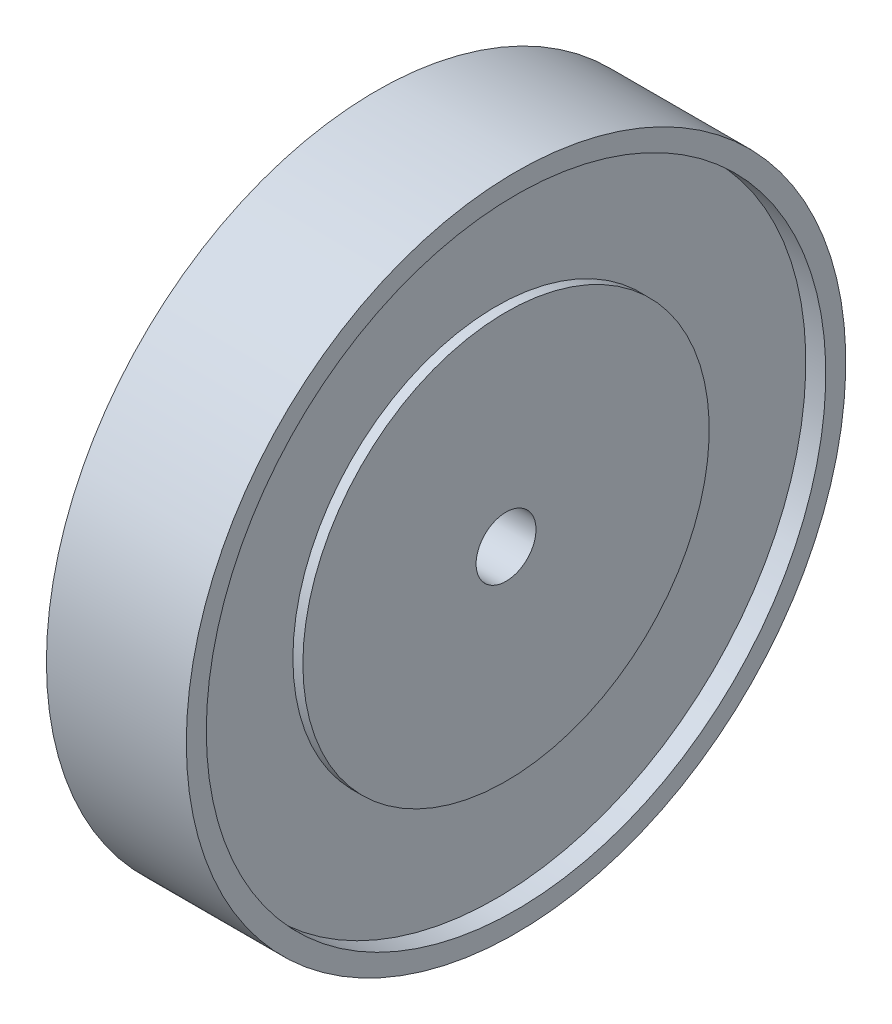
ISO-10303-21;
HEADER;
FILE_DESCRIPTION(('STEP AP214'),'2;1');
FILE_NAME('part.step','',(''),(''),'','','');
FILE_SCHEMA(('AUTOMOTIVE_DESIGN { 1 0 10303 214 1 1 1 1 }'));
ENDSEC;
DATA;
#1=APPLICATION_CONTEXT('core data for automotive mechanical design processes');
#2=APPLICATION_PROTOCOL_DEFINITION('international standard','automotive_design',2000,#1);
#3=PRODUCT_CONTEXT('',#1,'mechanical');
#4=PRODUCT('Part','Part','',(#3));
#5=PRODUCT_RELATED_PRODUCT_CATEGORY('part','',(#4));
#6=PRODUCT_DEFINITION_FORMATION('','',#4);
#7=PRODUCT_DEFINITION_CONTEXT('part definition',#1,'design');
#8=PRODUCT_DEFINITION('design','',#6,#7);
#9=PRODUCT_DEFINITION_SHAPE('','',#8);
#10=(LENGTH_UNIT() NAMED_UNIT(*) SI_UNIT(.MILLI.,.METRE.));
#11=(NAMED_UNIT(*) PLANE_ANGLE_UNIT() SI_UNIT($,.RADIAN.));
#12=(NAMED_UNIT(*) SI_UNIT($,.STERADIAN.) SOLID_ANGLE_UNIT());
#13=UNCERTAINTY_MEASURE_WITH_UNIT(LENGTH_MEASURE(1.E-05),#10,'distance_accuracy_value','');
#14=(GEOMETRIC_REPRESENTATION_CONTEXT(3) GLOBAL_UNCERTAINTY_ASSIGNED_CONTEXT((#13)) GLOBAL_UNIT_ASSIGNED_CONTEXT((#10,
#11,#12)) REPRESENTATION_CONTEXT('',''));
#15=CARTESIAN_POINT('',(0.,0.,0.));
#16=DIRECTION('',(0.,0.,1.));
#17=DIRECTION('',(1.,0.,0.));
#18=AXIS2_PLACEMENT_3D('',#15,#16,#17);
#19=CARTESIAN_POINT('',(0.,0.,0.));
#20=DIRECTION('',(-1.,0.,0.));
#21=DIRECTION('',(0.,0.,1.));
#22=AXIS2_PLACEMENT_3D('',#19,#20,#21);
#23=CYLINDRICAL_SURFACE('',#22,15.);
#24=CARTESIAN_POINT('',(-30.,0.,0.));
#25=DIRECTION('',(-1.,0.,0.));
#26=DIRECTION('',(0.,0.,1.));
#27=AXIS2_PLACEMENT_3D('',#24,#25,#26);
#28=CIRCLE('',#27,15.);
#29=CARTESIAN_POINT('',(-30.,0.,15.));
#30=VERTEX_POINT('',#29);
#31=EDGE_CURVE('E75',#30,#30,#28,.T.);
#32=ORIENTED_EDGE('',*,*,#31,.T.);
#33=EDGE_LOOP('',(#32));
#34=FACE_BOUND('',#33,.T.);
#35=CARTESIAN_POINT('',(30.,0.,0.));
#36=DIRECTION('',(-1.,0.,0.));
#37=DIRECTION('',(0.,0.,1.));
#38=AXIS2_PLACEMENT_3D('',#35,#36,#37);
#39=CIRCLE('',#38,15.);
#40=CARTESIAN_POINT('',(30.,0.,15.));
#41=VERTEX_POINT('',#40);
#42=EDGE_CURVE('E10',#41,#41,#39,.T.);
#43=ORIENTED_EDGE('',*,*,#42,.F.);
#44=EDGE_LOOP('',(#43));
#45=FACE_BOUND('',#44,.T.);
#46=ADVANCED_FACE('F35',(#34,#45),#23,.F.);
#47=CARTESIAN_POINT('',(30.,0.,0.));
#48=DIRECTION('',(1.,0.,0.));
#49=DIRECTION('',(0.,0.,-1.));
#50=AXIS2_PLACEMENT_3D('',#47,#48,#49);
#51=PLANE('',#50);
#52=ORIENTED_EDGE('',*,*,#42,.T.);
#53=EDGE_LOOP('',(#52));
#54=FACE_BOUND('',#53,.T.);
#55=CARTESIAN_POINT('',(30.,0.,0.));
#56=DIRECTION('',(-1.,0.,0.));
#57=DIRECTION('',(0.,0.,1.));
#58=AXIS2_PLACEMENT_3D('',#55,#56,#57);
#59=CIRCLE('',#58,101.665831818793);
#60=CARTESIAN_POINT('',(30.,0.,101.665831818793));
#61=VERTEX_POINT('',#60);
#62=EDGE_CURVE('E41',#61,#61,#59,.T.);
#63=ORIENTED_EDGE('',*,*,#62,.F.);
#64=EDGE_LOOP('',(#63));
#65=FACE_BOUND('',#64,.T.);
#66=ADVANCED_FACE('F123',(#54,#65),#51,.T.);
#67=CARTESIAN_POINT('',(0.,0.,0.));
#68=DIRECTION('',(-1.,0.,0.));
#69=DIRECTION('',(0.,0.,1.));
#70=AXIS2_PLACEMENT_3D('',#67,#68,#69);
#71=CYLINDRICAL_SURFACE('',#70,101.665831818793);
#72=ORIENTED_EDGE('',*,*,#62,.T.);
#73=EDGE_LOOP('',(#72));
#74=FACE_BOUND('',#73,.T.);
#75=CARTESIAN_POINT('',(25.,0.,0.));
#76=DIRECTION('',(-1.,0.,0.));
#77=DIRECTION('',(0.,0.,1.));
#78=AXIS2_PLACEMENT_3D('',#75,#76,#77);
#79=CIRCLE('',#78,101.665831818793);
#80=CARTESIAN_POINT('',(25.,0.,101.665831818793));
#81=VERTEX_POINT('',#80);
#82=EDGE_CURVE('E45',#81,#81,#79,.T.);
#83=ORIENTED_EDGE('',*,*,#82,.F.);
#84=EDGE_LOOP('',(#83));
#85=FACE_BOUND('',#84,.T.);
#86=ADVANCED_FACE('F127',(#74,#85),#71,.T.);
#87=CARTESIAN_POINT('',(25.,0.,0.));
#88=DIRECTION('',(1.,0.,0.));
#89=DIRECTION('',(0.,0.,-1.));
#90=AXIS2_PLACEMENT_3D('',#87,#88,#89);
#91=PLANE('',#90);
#92=ORIENTED_EDGE('',*,*,#82,.T.);
#93=EDGE_LOOP('',(#92));
#94=FACE_BOUND('',#93,.T.);
#95=CARTESIAN_POINT('',(25.,0.,0.));
#96=DIRECTION('',(-1.,0.,0.));
#97=DIRECTION('',(0.,0.,1.));
#98=AXIS2_PLACEMENT_3D('',#95,#96,#97);
#99=CIRCLE('',#98,155.);
#100=CARTESIAN_POINT('',(25.,0.,155.));
#101=VERTEX_POINT('',#100);
#102=EDGE_CURVE('E49',#101,#101,#99,.T.);
#103=ORIENTED_EDGE('',*,*,#102,.F.);
#104=EDGE_LOOP('',(#103));
#105=FACE_BOUND('',#104,.T.);
#106=ADVANCED_FACE('F131',(#94,#105),#91,.T.);
#107=CARTESIAN_POINT('',(0.,0.,0.));
#108=DIRECTION('',(-1.,0.,0.));
#109=DIRECTION('',(0.,0.,1.));
#110=AXIS2_PLACEMENT_3D('',#107,#108,#109);
#111=CYLINDRICAL_SURFACE('',#110,155.);
#112=ORIENTED_EDGE('',*,*,#102,.T.);
#113=EDGE_LOOP('',(#112));
#114=FACE_BOUND('',#113,.T.);
#115=CARTESIAN_POINT('',(35.,0.,0.));
#116=DIRECTION('',(-1.,0.,0.));
#117=DIRECTION('',(0.,0.,1.));
#118=AXIS2_PLACEMENT_3D('',#115,#116,#117);
#119=CIRCLE('',#118,155.);
#120=CARTESIAN_POINT('',(35.,0.,155.));
#121=VERTEX_POINT('',#120);
#122=EDGE_CURVE('E54',#121,#121,#119,.T.);
#123=ORIENTED_EDGE('',*,*,#122,.F.);
#124=EDGE_LOOP('',(#123));
#125=FACE_BOUND('',#124,.T.);
#126=ADVANCED_FACE('F119',(#114,#125),#111,.F.);
#127=CARTESIAN_POINT('',(35.,0.,0.));
#128=DIRECTION('',(1.,0.,0.));
#129=DIRECTION('',(0.,0.,-1.));
#130=AXIS2_PLACEMENT_3D('',#127,#128,#129);
#131=PLANE('',#130);
#132=ORIENTED_EDGE('',*,*,#122,.T.);
#133=EDGE_LOOP('',(#132));
#134=FACE_BOUND('',#133,.T.);
#135=CARTESIAN_POINT('',(35.,0.,0.));
#136=DIRECTION('',(-1.,0.,0.));
#137=DIRECTION('',(0.,0.,1.));
#138=AXIS2_PLACEMENT_3D('',#135,#136,#137);
#139=CIRCLE('',#138,165.);
#140=CARTESIAN_POINT('',(35.,0.,165.));
#141=VERTEX_POINT('',#140);
#142=EDGE_CURVE('E57',#141,#141,#139,.T.);
#143=ORIENTED_EDGE('',*,*,#142,.F.);
#144=EDGE_LOOP('',(#143));
#145=FACE_BOUND('',#144,.T.);
#146=ADVANCED_FACE('F113',(#134,#145),#131,.T.);
#147=CARTESIAN_POINT('',(0.,0.,0.));
#148=DIRECTION('',(-1.,0.,0.));
#149=DIRECTION('',(0.,0.,1.));
#150=AXIS2_PLACEMENT_3D('',#147,#148,#149);
#151=CYLINDRICAL_SURFACE('',#150,165.);
#152=ORIENTED_EDGE('',*,*,#142,.T.);
#153=EDGE_LOOP('',(#152));
#154=FACE_BOUND('',#153,.T.);
#155=CARTESIAN_POINT('',(-35.,0.,0.));
#156=DIRECTION('',(-1.,0.,0.));
#157=DIRECTION('',(0.,0.,1.));
#158=AXIS2_PLACEMENT_3D('',#155,#156,#157);
#159=CIRCLE('',#158,165.);
#160=CARTESIAN_POINT('',(-35.,0.,165.));
#161=VERTEX_POINT('',#160);
#162=EDGE_CURVE('E60',#161,#161,#159,.T.);
#163=ORIENTED_EDGE('',*,*,#162,.F.);
#164=EDGE_LOOP('',(#163));
#165=FACE_BOUND('',#164,.T.);
#166=ADVANCED_FACE('F108',(#154,#165),#151,.T.);
#167=CARTESIAN_POINT('',(-35.,0.,0.));
#168=DIRECTION('',(1.,0.,0.));
#169=DIRECTION('',(0.,0.,-1.));
#170=AXIS2_PLACEMENT_3D('',#167,#168,#169);
#171=PLANE('',#170);
#172=CARTESIAN_POINT('',(-35.,0.,0.));
#173=DIRECTION('',(-1.,0.,0.));
#174=DIRECTION('',(0.,0.,1.));
#175=AXIS2_PLACEMENT_3D('',#172,#173,#174);
#176=CIRCLE('',#175,155.);
#177=CARTESIAN_POINT('',(-35.,0.,155.));
#178=VERTEX_POINT('',#177);
#179=EDGE_CURVE('E63',#178,#178,#176,.T.);
#180=ORIENTED_EDGE('',*,*,#179,.F.);
#181=EDGE_LOOP('',(#180));
#182=FACE_BOUND('',#181,.T.);
#183=ORIENTED_EDGE('',*,*,#162,.T.);
#184=EDGE_LOOP('',(#183));
#185=FACE_BOUND('',#184,.T.);
#186=ADVANCED_FACE('F102',(#182,#185),#171,.F.);
#187=CARTESIAN_POINT('',(0.,0.,0.));
#188=DIRECTION('',(-1.,0.,0.));
#189=DIRECTION('',(0.,0.,1.));
#190=AXIS2_PLACEMENT_3D('',#187,#188,#189);
#191=CYLINDRICAL_SURFACE('',#190,155.);
#192=CARTESIAN_POINT('',(-25.,0.,0.));
#193=DIRECTION('',(-1.,0.,0.));
#194=DIRECTION('',(0.,0.,1.));
#195=AXIS2_PLACEMENT_3D('',#192,#193,#194);
#196=CIRCLE('',#195,155.);
#197=CARTESIAN_POINT('',(-25.,0.,155.));
#198=VERTEX_POINT('',#197);
#199=EDGE_CURVE('E66',#198,#198,#196,.T.);
#200=ORIENTED_EDGE('',*,*,#199,.F.);
#201=EDGE_LOOP('',(#200));
#202=FACE_BOUND('',#201,.T.);
#203=ORIENTED_EDGE('',*,*,#179,.T.);
#204=EDGE_LOOP('',(#203));
#205=FACE_BOUND('',#204,.T.);
#206=ADVANCED_FACE('F96',(#202,#205),#191,.F.);
#207=CARTESIAN_POINT('',(-25.,0.,0.));
#208=DIRECTION('',(1.,0.,0.));
#209=DIRECTION('',(0.,0.,-1.));
#210=AXIS2_PLACEMENT_3D('',#207,#208,#209);
#211=PLANE('',#210);
#212=CARTESIAN_POINT('',(-25.,0.,0.));
#213=DIRECTION('',(-1.,0.,0.));
#214=DIRECTION('',(0.,0.,1.));
#215=AXIS2_PLACEMENT_3D('',#212,#213,#214);
#216=CIRCLE('',#215,101.665831818793);
#217=CARTESIAN_POINT('',(-25.,0.,101.665831818793));
#218=VERTEX_POINT('',#217);
#219=EDGE_CURVE('E69',#218,#218,#216,.T.);
#220=ORIENTED_EDGE('',*,*,#219,.F.);
#221=EDGE_LOOP('',(#220));
#222=FACE_BOUND('',#221,.T.);
#223=ORIENTED_EDGE('',*,*,#199,.T.);
#224=EDGE_LOOP('',(#223));
#225=FACE_BOUND('',#224,.T.);
#226=ADVANCED_FACE('F90',(#222,#225),#211,.F.);
#227=CARTESIAN_POINT('',(0.,0.,0.));
#228=DIRECTION('',(-1.,0.,0.));
#229=DIRECTION('',(0.,0.,1.));
#230=AXIS2_PLACEMENT_3D('',#227,#228,#229);
#231=CYLINDRICAL_SURFACE('',#230,101.665831818793);
#232=CARTESIAN_POINT('',(-30.,0.,0.));
#233=DIRECTION('',(-1.,0.,0.));
#234=DIRECTION('',(0.,0.,1.));
#235=AXIS2_PLACEMENT_3D('',#232,#233,#234);
#236=CIRCLE('',#235,101.665831818793);
#237=CARTESIAN_POINT('',(-30.,0.,101.665831818793));
#238=VERTEX_POINT('',#237);
#239=EDGE_CURVE('E72',#238,#238,#236,.T.);
#240=ORIENTED_EDGE('',*,*,#239,.F.);
#241=EDGE_LOOP('',(#240));
#242=FACE_BOUND('',#241,.T.);
#243=ORIENTED_EDGE('',*,*,#219,.T.);
#244=EDGE_LOOP('',(#243));
#245=FACE_BOUND('',#244,.T.);
#246=ADVANCED_FACE('F84',(#242,#245),#231,.T.);
#247=CARTESIAN_POINT('',(-30.,0.,0.));
#248=DIRECTION('',(1.,0.,0.));
#249=DIRECTION('',(0.,0.,-1.));
#250=AXIS2_PLACEMENT_3D('',#247,#248,#249);
#251=PLANE('',#250);
#252=ORIENTED_EDGE('',*,*,#31,.F.);
#253=EDGE_LOOP('',(#252));
#254=FACE_BOUND('',#253,.T.);
#255=ORIENTED_EDGE('',*,*,#239,.T.);
#256=EDGE_LOOP('',(#255));
#257=FACE_BOUND('',#256,.T.);
#258=ADVANCED_FACE('F81',(#254,#257),#251,.F.);
#259=CLOSED_SHELL('',(#46,#66,#86,#106,#126,#146,#166,#186,#206,#226,#246,#258));
#260=MANIFOLD_SOLID_BREP('B2',#259);
#261=ADVANCED_BREP_SHAPE_REPRESENTATION('',(#18,#260),#14);
#262=SHAPE_DEFINITION_REPRESENTATION(#9,#261);
ENDSEC;
END-ISO-10303-21;
